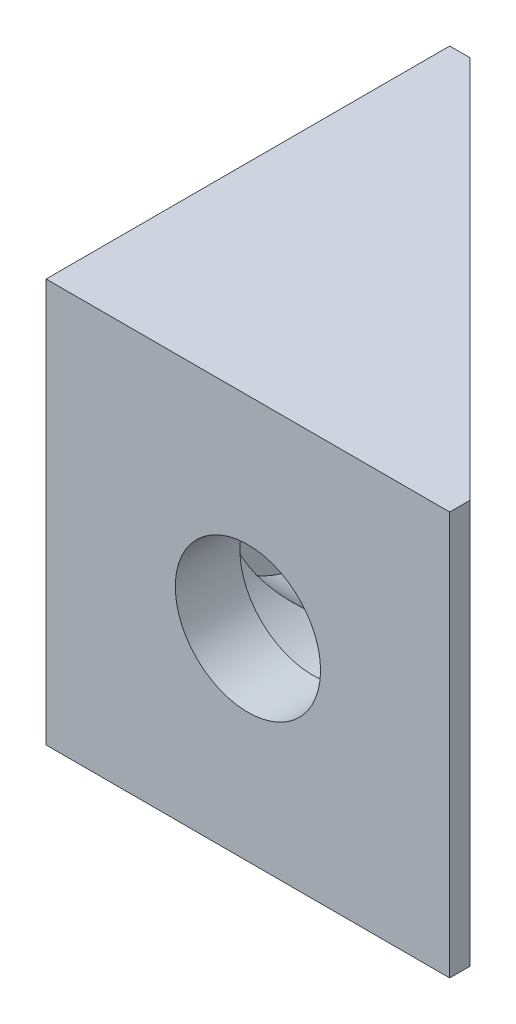
ISO-10303-21;
HEADER;
FILE_DESCRIPTION(('STEP AP214'),'2;1');
FILE_NAME('part.step','',(''),(''),'','','');
FILE_SCHEMA(('AUTOMOTIVE_DESIGN { 1 0 10303 214 1 1 1 1 }'));
ENDSEC;
DATA;
#1=APPLICATION_CONTEXT('core data for automotive mechanical design processes');
#2=APPLICATION_PROTOCOL_DEFINITION('international standard','automotive_design',2000,#1);
#3=PRODUCT_CONTEXT('',#1,'mechanical');
#4=PRODUCT('Part','Part','',(#3));
#5=PRODUCT_RELATED_PRODUCT_CATEGORY('part','',(#4));
#6=PRODUCT_DEFINITION_FORMATION('','',#4);
#7=PRODUCT_DEFINITION_CONTEXT('part definition',#1,'design');
#8=PRODUCT_DEFINITION('design','',#6,#7);
#9=PRODUCT_DEFINITION_SHAPE('','',#8);
#10=(LENGTH_UNIT() NAMED_UNIT(*) SI_UNIT(.MILLI.,.METRE.));
#11=(NAMED_UNIT(*) PLANE_ANGLE_UNIT() SI_UNIT($,.RADIAN.));
#12=(NAMED_UNIT(*) SI_UNIT($,.STERADIAN.) SOLID_ANGLE_UNIT());
#13=UNCERTAINTY_MEASURE_WITH_UNIT(LENGTH_MEASURE(1.E-05),#10,'distance_accuracy_value','');
#14=(GEOMETRIC_REPRESENTATION_CONTEXT(3) GLOBAL_UNCERTAINTY_ASSIGNED_CONTEXT((#13)) GLOBAL_UNIT_ASSIGNED_CONTEXT((#10,
#11,#12)) REPRESENTATION_CONTEXT('',''));
#15=CARTESIAN_POINT('',(0.,0.,0.));
#16=DIRECTION('',(0.,0.,1.));
#17=DIRECTION('',(1.,0.,0.));
#18=AXIS2_PLACEMENT_3D('',#15,#16,#17);
#19=CARTESIAN_POINT('',(10.,0.,-29.778174593052));
#20=DIRECTION('',(0.,0.,1.));
#21=DIRECTION('',(1.,0.,0.));
#22=AXIS2_PLACEMENT_3D('',#19,#20,#21);
#23=CYLINDRICAL_SURFACE('',#22,5.5);
#24=CARTESIAN_POINT('',(10.,0.,-3.2));
#25=DIRECTION('',(0.,0.,1.));
#26=DIRECTION('',(1.,0.,0.));
#27=AXIS2_PLACEMENT_3D('',#24,#25,#26);
#28=CIRCLE('',#27,5.5);
#29=CARTESIAN_POINT('',(15.5,0.,-3.2));
#30=VERTEX_POINT('',#29);
#31=EDGE_CURVE('E163',#30,#30,#28,.T.);
#32=ORIENTED_EDGE('',*,*,#31,.T.);
#33=EDGE_LOOP('',(#32));
#34=FACE_BOUND('',#33,.T.);
#35=CARTESIAN_POINT('',(10.,0.,-10.));
#36=DIRECTION('',(0.707106781186547,0.,0.707106781186547));
#37=DIRECTION('',(-0.707106781186547,0.,0.707106781186547));
#38=AXIS2_PLACEMENT_3D('',#35,#36,#37);
#39=ELLIPSE('',#38,7.77817459305202,5.5);
#40=CARTESIAN_POINT('',(10.,-5.5,-10.));
#41=VERTEX_POINT('',#40);
#42=CARTESIAN_POINT('',(10.,5.5,-10.));
#43=VERTEX_POINT('',#42);
#44=EDGE_CURVE('E54',#41,#43,#39,.F.);
#45=ORIENTED_EDGE('',*,*,#44,.T.);
#46=CARTESIAN_POINT('',(10.,0.,-10.));
#47=DIRECTION('',(-0.707106781186547,0.,0.707106781186547));
#48=DIRECTION('',(0.707106781186547,0.,0.707106781186547));
#49=AXIS2_PLACEMENT_3D('',#46,#47,#48);
#50=ELLIPSE('',#49,7.77817459305202,5.5);
#51=EDGE_CURVE('E11',#43,#41,#50,.F.);
#52=ORIENTED_EDGE('',*,*,#51,.T.);
#53=EDGE_LOOP('',(#45,#52));
#54=FACE_BOUND('',#53,.T.);
#55=ADVANCED_FACE('F41',(#34,#54),#23,.F.);
#56=CARTESIAN_POINT('',(20.,10.,0.));
#57=DIRECTION('',(0.,0.,-1.));
#58=DIRECTION('',(-1.,0.,0.));
#59=AXIS2_PLACEMENT_3D('',#56,#57,#58);
#60=PLANE('',#59);
#61=CARTESIAN_POINT('',(10.,0.,0.));
#62=DIRECTION('',(0.,0.,1.));
#63=DIRECTION('',(1.,0.,0.));
#64=AXIS2_PLACEMENT_3D('',#61,#62,#63);
#65=CIRCLE('',#64,3.6);
#66=CARTESIAN_POINT('',(13.6,0.,0.));
#67=VERTEX_POINT('',#66);
#68=EDGE_CURVE('E131',#67,#67,#65,.T.);
#69=ORIENTED_EDGE('',*,*,#68,.F.);
#70=EDGE_LOOP('',(#69));
#71=FACE_BOUND('',#70,.T.);
#72=DIRECTION('',(1.,0.,0.));
#73=VECTOR('',#72,1.);
#74=CARTESIAN_POINT('',(20.,-10.,0.));
#75=LINE('',#74,#73);
#76=CARTESIAN_POINT('',(0.,-10.,0.));
#77=VERTEX_POINT('',#76);
#78=CARTESIAN_POINT('',(20.,-10.,0.));
#79=VERTEX_POINT('',#78);
#80=EDGE_CURVE('E127',#77,#79,#75,.T.);
#81=ORIENTED_EDGE('',*,*,#80,.T.);
#82=DIRECTION('',(0.,-1.,0.));
#83=VECTOR('',#82,1.);
#84=CARTESIAN_POINT('',(20.,10.,0.));
#85=LINE('',#84,#83);
#86=CARTESIAN_POINT('',(20.,10.,0.));
#87=VERTEX_POINT('',#86);
#88=EDGE_CURVE('E141',#87,#79,#85,.T.);
#89=ORIENTED_EDGE('',*,*,#88,.F.);
#90=DIRECTION('',(1.,0.,0.));
#91=VECTOR('',#90,1.);
#92=CARTESIAN_POINT('',(20.,10.,0.));
#93=LINE('',#92,#91);
#94=CARTESIAN_POINT('',(0.,10.,0.));
#95=VERTEX_POINT('',#94);
#96=EDGE_CURVE('E137',#95,#87,#93,.T.);
#97=ORIENTED_EDGE('',*,*,#96,.F.);
#98=DIRECTION('',(0.,-1.,0.));
#99=VECTOR('',#98,1.);
#100=CARTESIAN_POINT('',(0.,10.,0.));
#101=LINE('',#100,#99);
#102=EDGE_CURVE('E123',#95,#77,#101,.T.);
#103=ORIENTED_EDGE('',*,*,#102,.T.);
#104=EDGE_LOOP('',(#81,#89,#97,#103));
#105=FACE_BOUND('',#104,.T.);
#106=ADVANCED_FACE('F43',(#71,#105),#60,.F.);
#107=CARTESIAN_POINT('',(20.,10.,0.));
#108=DIRECTION('',(-1.,0.,0.));
#109=DIRECTION('',(0.,0.,1.));
#110=AXIS2_PLACEMENT_3D('',#107,#108,#109);
#111=PLANE('',#110);
#112=DIRECTION('',(0.,0.,-1.));
#113=VECTOR('',#112,1.);
#114=CARTESIAN_POINT('',(20.,-10.,0.));
#115=LINE('',#114,#113);
#116=CARTESIAN_POINT('',(20.,-10.,-1.));
#117=VERTEX_POINT('',#116);
#118=EDGE_CURVE('E130',#79,#117,#115,.T.);
#119=ORIENTED_EDGE('',*,*,#118,.T.);
#120=DIRECTION('',(0.,-1.,0.));
#121=VECTOR('',#120,1.);
#122=CARTESIAN_POINT('',(20.,10.,-1.));
#123=LINE('',#122,#121);
#124=CARTESIAN_POINT('',(20.,10.,-1.));
#125=VERTEX_POINT('',#124);
#126=EDGE_CURVE('E118',#125,#117,#123,.T.);
#127=ORIENTED_EDGE('',*,*,#126,.F.);
#128=DIRECTION('',(0.,0.,-1.));
#129=VECTOR('',#128,1.);
#130=CARTESIAN_POINT('',(20.,10.,0.));
#131=LINE('',#130,#129);
#132=EDGE_CURVE('E96',#87,#125,#131,.T.);
#133=ORIENTED_EDGE('',*,*,#132,.F.);
#134=ORIENTED_EDGE('',*,*,#88,.T.);
#135=EDGE_LOOP('',(#119,#127,#133,#134));
#136=FACE_BOUND('',#135,.T.);
#137=ADVANCED_FACE('F180',(#136),#111,.F.);
#138=CARTESIAN_POINT('',(1.,10.,-20.));
#139=DIRECTION('',(-0.707106781186548,0.,0.707106781186548));
#140=DIRECTION('',(0.707106781186548,0.,0.707106781186548));
#141=AXIS2_PLACEMENT_3D('',#138,#139,#140);
#142=PLANE('',#141);
#143=CARTESIAN_POINT('',(10.,0.,-11.));
#144=DIRECTION('',(-0.707106781186548,0.,0.707106781186548));
#145=DIRECTION('',(0.707106781186548,0.,0.707106781186548));
#146=AXIS2_PLACEMENT_3D('',#143,#144,#145);
#147=ELLIPSE('',#146,7.77817459305202,5.5);
#148=CARTESIAN_POINT('',(10.5000000000004,-5.47722557505166,-10.4999999999996));
#149=VERTEX_POINT('',#148);
#150=CARTESIAN_POINT('',(10.5000000000004,5.47722557505166,-10.4999999999996));
#151=VERTEX_POINT('',#150);
#152=EDGE_CURVE('E156',#149,#151,#147,.F.);
#153=ORIENTED_EDGE('',*,*,#152,.F.);
#154=CARTESIAN_POINT('',(11.,0.,-10.));
#155=DIRECTION('',(-0.707106781186548,0.,0.707106781186548));
#156=DIRECTION('',(-0.707106781186548,0.,-0.707106781186548));
#157=AXIS2_PLACEMENT_3D('',#154,#155,#156);
#158=ELLIPSE('',#157,7.77817459305202,5.5);
#159=EDGE_CURVE('E162',#151,#149,#158,.F.);
#160=ORIENTED_EDGE('',*,*,#159,.F.);
#161=EDGE_LOOP('',(#153,#160));
#162=FACE_BOUND('',#161,.T.);
#163=DIRECTION('',(-0.707106781186548,0.,-0.707106781186548));
#164=VECTOR('',#163,1.);
#165=CARTESIAN_POINT('',(1.,-10.,-20.));
#166=LINE('',#165,#164);
#167=CARTESIAN_POINT('',(1.,-10.,-20.));
#168=VERTEX_POINT('',#167);
#169=EDGE_CURVE('E115',#117,#168,#166,.T.);
#170=ORIENTED_EDGE('',*,*,#169,.T.);
#171=DIRECTION('',(0.,-1.,0.));
#172=VECTOR('',#171,1.);
#173=CARTESIAN_POINT('',(1.,10.,-20.));
#174=LINE('',#173,#172);
#175=CARTESIAN_POINT('',(1.,10.,-20.));
#176=VERTEX_POINT('',#175);
#177=EDGE_CURVE('E112',#176,#168,#174,.T.);
#178=ORIENTED_EDGE('',*,*,#177,.F.);
#179=DIRECTION('',(-0.707106781186548,0.,-0.707106781186548));
#180=VECTOR('',#179,1.);
#181=CARTESIAN_POINT('',(1.,10.,-20.));
#182=LINE('',#181,#180);
#183=EDGE_CURVE('E102',#125,#176,#182,.T.);
#184=ORIENTED_EDGE('',*,*,#183,.F.);
#185=ORIENTED_EDGE('',*,*,#126,.T.);
#186=EDGE_LOOP('',(#170,#178,#184,#185));
#187=FACE_BOUND('',#186,.T.);
#188=ADVANCED_FACE('F113',(#162,#187),#142,.F.);
#189=CARTESIAN_POINT('',(0.,10.,-20.));
#190=DIRECTION('',(0.,0.,1.));
#191=DIRECTION('',(1.,0.,0.));
#192=AXIS2_PLACEMENT_3D('',#189,#190,#191);
#193=PLANE('',#192);
#194=DIRECTION('',(-1.,0.,0.));
#195=VECTOR('',#194,1.);
#196=CARTESIAN_POINT('',(0.,-10.,-20.));
#197=LINE('',#196,#195);
#198=CARTESIAN_POINT('',(0.,-10.,-20.));
#199=VERTEX_POINT('',#198);
#200=EDGE_CURVE('E134',#168,#199,#197,.T.);
#201=ORIENTED_EDGE('',*,*,#200,.T.);
#202=DIRECTION('',(0.,-1.,0.));
#203=VECTOR('',#202,1.);
#204=CARTESIAN_POINT('',(0.,10.,-20.));
#205=LINE('',#204,#203);
#206=CARTESIAN_POINT('',(0.,10.,-20.));
#207=VERTEX_POINT('',#206);
#208=EDGE_CURVE('E119',#207,#199,#205,.T.);
#209=ORIENTED_EDGE('',*,*,#208,.F.);
#210=DIRECTION('',(-1.,0.,0.));
#211=VECTOR('',#210,1.);
#212=CARTESIAN_POINT('',(0.,10.,-20.));
#213=LINE('',#212,#211);
#214=EDGE_CURVE('E106',#176,#207,#213,.T.);
#215=ORIENTED_EDGE('',*,*,#214,.F.);
#216=ORIENTED_EDGE('',*,*,#177,.T.);
#217=EDGE_LOOP('',(#201,#209,#215,#216));
#218=FACE_BOUND('',#217,.T.);
#219=ADVANCED_FACE('F121',(#218),#193,.F.);
#220=CARTESIAN_POINT('',(0.,10.,0.));
#221=DIRECTION('',(1.,0.,0.));
#222=DIRECTION('',(0.,0.,-1.));
#223=AXIS2_PLACEMENT_3D('',#220,#221,#222);
#224=PLANE('',#223);
#225=CARTESIAN_POINT('',(0.,0.,-10.));
#226=DIRECTION('',(-1.,0.,0.));
#227=DIRECTION('',(0.,0.,1.));
#228=AXIS2_PLACEMENT_3D('',#225,#226,#227);
#229=CIRCLE('',#228,3.6);
#230=CARTESIAN_POINT('',(0.,0.,-6.4));
#231=VERTEX_POINT('',#230);
#232=EDGE_CURVE('E172',#231,#231,#229,.T.);
#233=ORIENTED_EDGE('',*,*,#232,.F.);
#234=EDGE_LOOP('',(#233));
#235=FACE_BOUND('',#234,.T.);
#236=DIRECTION('',(0.,0.,1.));
#237=VECTOR('',#236,1.);
#238=CARTESIAN_POINT('',(0.,-10.,0.));
#239=LINE('',#238,#237);
#240=EDGE_CURVE('E87',#199,#77,#239,.T.);
#241=ORIENTED_EDGE('',*,*,#240,.T.);
#242=ORIENTED_EDGE('',*,*,#102,.F.);
#243=DIRECTION('',(0.,0.,1.));
#244=VECTOR('',#243,1.);
#245=CARTESIAN_POINT('',(0.,10.,0.));
#246=LINE('',#245,#244);
#247=EDGE_CURVE('E63',#207,#95,#246,.T.);
#248=ORIENTED_EDGE('',*,*,#247,.F.);
#249=ORIENTED_EDGE('',*,*,#208,.T.);
#250=EDGE_LOOP('',(#241,#242,#248,#249));
#251=FACE_BOUND('',#250,.T.);
#252=ADVANCED_FACE('F183',(#235,#251),#224,.F.);
#253=CARTESIAN_POINT('',(0.,10.,0.));
#254=DIRECTION('',(0.,-1.,0.));
#255=DIRECTION('',(0.,0.,-1.));
#256=AXIS2_PLACEMENT_3D('',#253,#254,#255);
#257=PLANE('',#256);
#258=ORIENTED_EDGE('',*,*,#96,.T.);
#259=ORIENTED_EDGE('',*,*,#132,.T.);
#260=ORIENTED_EDGE('',*,*,#183,.T.);
#261=ORIENTED_EDGE('',*,*,#214,.T.);
#262=ORIENTED_EDGE('',*,*,#247,.T.);
#263=EDGE_LOOP('',(#258,#259,#260,#261,#262));
#264=FACE_BOUND('',#263,.T.);
#265=ADVANCED_FACE('F104',(#264),#257,.F.);
#266=CARTESIAN_POINT('',(0.,-10.,0.));
#267=DIRECTION('',(0.,-1.,0.));
#268=DIRECTION('',(0.,0.,-1.));
#269=AXIS2_PLACEMENT_3D('',#266,#267,#268);
#270=PLANE('',#269);
#271=ORIENTED_EDGE('',*,*,#80,.F.);
#272=ORIENTED_EDGE('',*,*,#240,.F.);
#273=ORIENTED_EDGE('',*,*,#200,.F.);
#274=ORIENTED_EDGE('',*,*,#169,.F.);
#275=ORIENTED_EDGE('',*,*,#118,.F.);
#276=EDGE_LOOP('',(#271,#272,#273,#274,#275));
#277=FACE_BOUND('',#276,.T.);
#278=ADVANCED_FACE('F182',(#277),#270,.T.);
#279=CARTESIAN_POINT('',(10.,0.,-23.2911688245431));
#280=DIRECTION('',(0.,0.,1.));
#281=DIRECTION('',(1.,0.,0.));
#282=AXIS2_PLACEMENT_3D('',#279,#280,#281);
#283=CYLINDRICAL_SURFACE('',#282,3.6);
#284=CARTESIAN_POINT('',(10.,0.,-3.2));
#285=DIRECTION('',(0.,0.,1.));
#286=DIRECTION('',(1.,0.,0.));
#287=AXIS2_PLACEMENT_3D('',#284,#285,#286);
#288=CIRCLE('',#287,3.6);
#289=CARTESIAN_POINT('',(13.6,0.,-3.2));
#290=VERTEX_POINT('',#289);
#291=EDGE_CURVE('E168',#290,#290,#288,.T.);
#292=ORIENTED_EDGE('',*,*,#291,.F.);
#293=EDGE_LOOP('',(#292));
#294=FACE_BOUND('',#293,.T.);
#295=ORIENTED_EDGE('',*,*,#68,.T.);
#296=EDGE_LOOP('',(#295));
#297=FACE_BOUND('',#296,.T.);
#298=ADVANCED_FACE('F208',(#294,#297),#283,.F.);
#299=CARTESIAN_POINT('',(10.,0.,-10.));
#300=DIRECTION('',(0.707106781186547,0.,0.707106781186547));
#301=DIRECTION('',(-0.707106781186547,0.,0.707106781186547));
#302=AXIS2_PLACEMENT_3D('',#299,#300,#301);
#303=ELLIPSE('',#302,7.77817459305202,5.5);
#304=EDGE_CURVE('E144',#151,#43,#303,.T.);
#305=ORIENTED_EDGE('',*,*,#304,.T.);
#306=CARTESIAN_POINT('',(10.,0.,-10.));
#307=DIRECTION('',(-0.707106781186547,0.,0.707106781186547));
#308=DIRECTION('',(0.707106781186547,0.,0.707106781186547));
#309=AXIS2_PLACEMENT_3D('',#306,#307,#308);
#310=ELLIPSE('',#309,7.77817459305202,5.5);
#311=EDGE_CURVE('E49',#43,#41,#310,.T.);
#312=ORIENTED_EDGE('',*,*,#311,.T.);
#313=EDGE_CURVE('E146',#41,#149,#303,.T.);
#314=ORIENTED_EDGE('',*,*,#313,.T.);
#315=ORIENTED_EDGE('',*,*,#152,.T.);
#316=EDGE_LOOP('',(#305,#312,#314,#315));
#317=FACE_BOUND('',#316,.T.);
#318=ADVANCED_FACE('F154',(#317),#23,.F.);
#319=CARTESIAN_POINT('',(10.,0.,-3.2));
#320=DIRECTION('',(0.,0.,1.));
#321=DIRECTION('',(1.,0.,0.));
#322=AXIS2_PLACEMENT_3D('',#319,#320,#321);
#323=PLANE('',#322);
#324=ORIENTED_EDGE('',*,*,#291,.T.);
#325=EDGE_LOOP('',(#324));
#326=FACE_BOUND('',#325,.T.);
#327=ORIENTED_EDGE('',*,*,#31,.F.);
#328=EDGE_LOOP('',(#327));
#329=FACE_BOUND('',#328,.T.);
#330=ADVANCED_FACE('F207',(#326,#329),#323,.F.);
#331=CARTESIAN_POINT('',(23.2911688245431,0.,-10.));
#332=DIRECTION('',(-1.,0.,0.));
#333=DIRECTION('',(0.,0.,1.));
#334=AXIS2_PLACEMENT_3D('',#331,#332,#333);
#335=CYLINDRICAL_SURFACE('',#334,3.6);
#336=CARTESIAN_POINT('',(3.2,0.,-10.));
#337=DIRECTION('',(-1.,0.,0.));
#338=DIRECTION('',(0.,0.,1.));
#339=AXIS2_PLACEMENT_3D('',#336,#337,#338);
#340=CIRCLE('',#339,3.6);
#341=CARTESIAN_POINT('',(3.2,0.,-6.4));
#342=VERTEX_POINT('',#341);
#343=EDGE_CURVE('E325',#342,#342,#340,.T.);
#344=ORIENTED_EDGE('',*,*,#343,.F.);
#345=EDGE_LOOP('',(#344));
#346=FACE_BOUND('',#345,.T.);
#347=ORIENTED_EDGE('',*,*,#232,.T.);
#348=EDGE_LOOP('',(#347));
#349=FACE_BOUND('',#348,.T.);
#350=ADVANCED_FACE('F212',(#346,#349),#335,.F.);
#351=CARTESIAN_POINT('',(3.2,0.,-10.));
#352=DIRECTION('',(-1.,0.,0.));
#353=DIRECTION('',(0.,0.,1.));
#354=AXIS2_PLACEMENT_3D('',#351,#352,#353);
#355=PLANE('',#354);
#356=ORIENTED_EDGE('',*,*,#343,.T.);
#357=EDGE_LOOP('',(#356));
#358=FACE_BOUND('',#357,.T.);
#359=CARTESIAN_POINT('',(3.2,0.,-10.));
#360=DIRECTION('',(-1.,0.,0.));
#361=DIRECTION('',(0.,0.,1.));
#362=AXIS2_PLACEMENT_3D('',#359,#360,#361);
#363=CIRCLE('',#362,5.5);
#364=CARTESIAN_POINT('',(3.2,0.,-4.5));
#365=VERTEX_POINT('',#364);
#366=EDGE_CURVE('E321',#365,#365,#363,.T.);
#367=ORIENTED_EDGE('',*,*,#366,.F.);
#368=EDGE_LOOP('',(#367));
#369=FACE_BOUND('',#368,.T.);
#370=ADVANCED_FACE('F282',(#358,#369),#355,.F.);
#371=CARTESIAN_POINT('',(29.778174593052,0.,-10.));
#372=DIRECTION('',(-1.,0.,0.));
#373=DIRECTION('',(0.,0.,1.));
#374=AXIS2_PLACEMENT_3D('',#371,#372,#373);
#375=CYLINDRICAL_SURFACE('',#374,5.5);
#376=ORIENTED_EDGE('',*,*,#366,.T.);
#377=EDGE_LOOP('',(#376));
#378=FACE_BOUND('',#377,.T.);
#379=ORIENTED_EDGE('',*,*,#44,.F.);
#380=ORIENTED_EDGE('',*,*,#311,.F.);
#381=EDGE_LOOP('',(#379,#380));
#382=FACE_BOUND('',#381,.T.);
#383=ADVANCED_FACE('F296',(#378,#382),#375,.F.);
#384=ORIENTED_EDGE('',*,*,#304,.F.);
#385=ORIENTED_EDGE('',*,*,#159,.T.);
#386=ORIENTED_EDGE('',*,*,#313,.F.);
#387=ORIENTED_EDGE('',*,*,#51,.F.);
#388=EDGE_LOOP('',(#384,#385,#386,#387));
#389=FACE_BOUND('',#388,.T.);
#390=ADVANCED_FACE('F305',(#389),#375,.F.);
#391=CLOSED_SHELL('',(#55,#106,#137,#188,#219,#252,#265,#278,#298,#318,#330,#350,#370,#383,#390));
#392=MANIFOLD_SOLID_BREP('B2',#391);
#393=ADVANCED_BREP_SHAPE_REPRESENTATION('',(#18,#392),#14);
#394=SHAPE_DEFINITION_REPRESENTATION(#9,#393);
ENDSEC;
END-ISO-10303-21;
